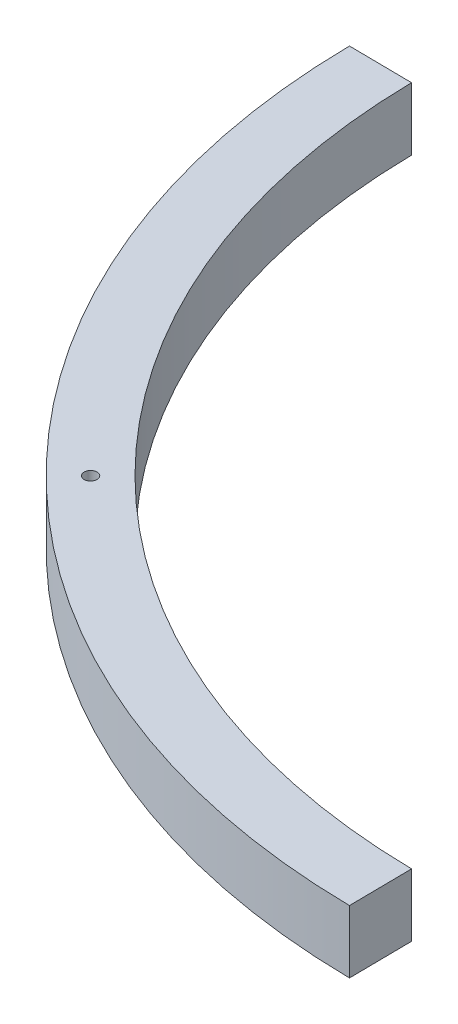
ISO-10303-21;
HEADER;
FILE_DESCRIPTION(('STEP AP214'),'2;1');
FILE_NAME('part.step','',(''),(''),'','','');
FILE_SCHEMA(('AUTOMOTIVE_DESIGN { 1 0 10303 214 1 1 1 1 }'));
ENDSEC;
DATA;
#1=APPLICATION_CONTEXT('core data for automotive mechanical design processes');
#2=APPLICATION_PROTOCOL_DEFINITION('international standard','automotive_design',2000,#1);
#3=PRODUCT_CONTEXT('',#1,'mechanical');
#4=PRODUCT('Part','Part','',(#3));
#5=PRODUCT_RELATED_PRODUCT_CATEGORY('part','',(#4));
#6=PRODUCT_DEFINITION_FORMATION('','',#4);
#7=PRODUCT_DEFINITION_CONTEXT('part definition',#1,'design');
#8=PRODUCT_DEFINITION('design','',#6,#7);
#9=PRODUCT_DEFINITION_SHAPE('','',#8);
#10=(LENGTH_UNIT() NAMED_UNIT(*) SI_UNIT(.MILLI.,.METRE.));
#11=(NAMED_UNIT(*) PLANE_ANGLE_UNIT() SI_UNIT($,.RADIAN.));
#12=(NAMED_UNIT(*) SI_UNIT($,.STERADIAN.) SOLID_ANGLE_UNIT());
#13=UNCERTAINTY_MEASURE_WITH_UNIT(LENGTH_MEASURE(1.E-05),#10,'distance_accuracy_value','');
#14=(GEOMETRIC_REPRESENTATION_CONTEXT(3) GLOBAL_UNCERTAINTY_ASSIGNED_CONTEXT((#13)) GLOBAL_UNIT_ASSIGNED_CONTEXT((#10,
#11,#12)) REPRESENTATION_CONTEXT('',''));
#15=CARTESIAN_POINT('',(0.,0.,0.));
#16=DIRECTION('',(0.,0.,1.));
#17=DIRECTION('',(1.,0.,0.));
#18=AXIS2_PLACEMENT_3D('',#15,#16,#17);
#19=CARTESIAN_POINT('',(90.,15.,-90.));
#20=DIRECTION('',(0.,1.,0.));
#21=DIRECTION('',(0.,0.,1.));
#22=AXIS2_PLACEMENT_3D('',#19,#20,#21);
#23=PLANE('',#22);
#24=CARTESIAN_POINT('',(90.,15.,-90.));
#25=DIRECTION('',(0.,1.,0.));
#26=DIRECTION('',(0.,0.,1.));
#27=AXIS2_PLACEMENT_3D('',#24,#25,#26);
#28=CIRCLE('',#27,180.011984766246);
#29=CARTESIAN_POINT('',(-90.,15.,-87.9228241569348));
#30=VERTEX_POINT('',#29);
#31=CARTESIAN_POINT('',(87.9228241569358,15.,90.));
#32=VERTEX_POINT('',#31);
#33=EDGE_CURVE('E92',#30,#32,#28,.T.);
#34=ORIENTED_EDGE('',*,*,#33,.T.);
#35=DIRECTION('',(-0.011620433145782,0.,-0.99993248048731));
#36=VECTOR('',#35,1.);
#37=CARTESIAN_POINT('',(87.9228241569358,15.,90.));
#38=LINE('',#37,#36);
#39=CARTESIAN_POINT('',(87.748327336338,15.,74.9846355580292));
#40=VERTEX_POINT('',#39);
#41=EDGE_CURVE('E87',#32,#40,#38,.T.);
#42=ORIENTED_EDGE('',*,*,#41,.T.);
#43=CARTESIAN_POINT('',(90.,15.,-90.));
#44=DIRECTION('',(0.,-1.,0.));
#45=DIRECTION('',(0.,0.,1.));
#46=AXIS2_PLACEMENT_3D('',#43,#44,#45);
#47=CIRCLE('',#46,165.);
#48=CARTESIAN_POINT('',(-74.9846583776807,15.,-87.75));
#49=VERTEX_POINT('',#48);
#50=EDGE_CURVE('E90',#40,#49,#47,.T.);
#51=ORIENTED_EDGE('',*,*,#50,.T.);
#52=DIRECTION('',(-0.999933768389495,0.,-0.011509076174179));
#53=VECTOR('',#52,1.);
#54=CARTESIAN_POINT('',(-90.,15.,-87.9228241569348));
#55=LINE('',#54,#53);
#56=EDGE_CURVE('E57',#49,#30,#55,.T.);
#57=ORIENTED_EDGE('',*,*,#56,.T.);
#58=EDGE_LOOP('',(#34,#42,#51,#57));
#59=FACE_BOUND('',#58,.T.);
#60=CARTESIAN_POINT('',(-31.9759197546794,15.,31.9759197546794));
#61=DIRECTION('',(0.,1.,0.));
#62=DIRECTION('',(0.,0.,1.));
#63=AXIS2_PLACEMENT_3D('',#60,#61,#62);
#64=CIRCLE('',#63,1.55);
#65=CARTESIAN_POINT('',(-31.9759197546794,15.,33.5259197546794));
#66=VERTEX_POINT('',#65);
#67=EDGE_CURVE('E112',#66,#66,#64,.T.);
#68=ORIENTED_EDGE('',*,*,#67,.F.);
#69=EDGE_LOOP('',(#68));
#70=FACE_BOUND('',#69,.T.);
#71=ADVANCED_FACE('F39',(#59,#70),#23,.T.);
#72=CARTESIAN_POINT('',(90.,0.,-90.));
#73=DIRECTION('',(0.,1.,0.));
#74=DIRECTION('',(0.,0.,1.));
#75=AXIS2_PLACEMENT_3D('',#72,#73,#74);
#76=PLANE('',#75);
#77=CARTESIAN_POINT('',(90.,0.,-90.));
#78=DIRECTION('',(0.,1.,0.));
#79=DIRECTION('',(0.,0.,1.));
#80=AXIS2_PLACEMENT_3D('',#77,#78,#79);
#81=CIRCLE('',#80,180.011984766246);
#82=CARTESIAN_POINT('',(-90.,0.,-87.9228241569348));
#83=VERTEX_POINT('',#82);
#84=CARTESIAN_POINT('',(87.9228241569358,0.,90.));
#85=VERTEX_POINT('',#84);
#86=EDGE_CURVE('E108',#83,#85,#81,.T.);
#87=ORIENTED_EDGE('',*,*,#86,.F.);
#88=DIRECTION('',(-0.999933768389495,0.,-0.011509076174179));
#89=VECTOR('',#88,1.);
#90=CARTESIAN_POINT('',(-90.,0.,-87.9228241569348));
#91=LINE('',#90,#89);
#92=CARTESIAN_POINT('',(-74.9846583776807,0.,-87.75));
#93=VERTEX_POINT('',#92);
#94=EDGE_CURVE('E80',#93,#83,#91,.T.);
#95=ORIENTED_EDGE('',*,*,#94,.F.);
#96=CARTESIAN_POINT('',(90.,0.,-90.));
#97=DIRECTION('',(0.,-1.,0.));
#98=DIRECTION('',(0.,0.,1.));
#99=AXIS2_PLACEMENT_3D('',#96,#97,#98);
#100=CIRCLE('',#99,165.);
#101=CARTESIAN_POINT('',(87.748327336338,0.,74.9846355580292));
#102=VERTEX_POINT('',#101);
#103=EDGE_CURVE('E74',#102,#93,#100,.T.);
#104=ORIENTED_EDGE('',*,*,#103,.F.);
#105=DIRECTION('',(-0.011620433145782,0.,-0.99993248048731));
#106=VECTOR('',#105,1.);
#107=CARTESIAN_POINT('',(87.9228241569358,0.,90.));
#108=LINE('',#107,#106);
#109=EDGE_CURVE('E97',#85,#102,#108,.T.);
#110=ORIENTED_EDGE('',*,*,#109,.F.);
#111=EDGE_LOOP('',(#87,#95,#104,#110));
#112=FACE_BOUND('',#111,.T.);
#113=CARTESIAN_POINT('',(-31.9759197546794,0.,31.9759197546794));
#114=DIRECTION('',(0.,1.,0.));
#115=DIRECTION('',(0.,0.,1.));
#116=AXIS2_PLACEMENT_3D('',#113,#114,#115);
#117=CIRCLE('',#116,1.55);
#118=CARTESIAN_POINT('',(-31.9759197546794,0.,33.5259197546794));
#119=VERTEX_POINT('',#118);
#120=EDGE_CURVE('E130',#119,#119,#117,.T.);
#121=ORIENTED_EDGE('',*,*,#120,.T.);
#122=EDGE_LOOP('',(#121));
#123=FACE_BOUND('',#122,.T.);
#124=ADVANCED_FACE('F125',(#112,#123),#76,.F.);
#125=CARTESIAN_POINT('',(90.,15.,-90.));
#126=DIRECTION('',(0.,-1.,0.));
#127=DIRECTION('',(0.,0.,-1.));
#128=AXIS2_PLACEMENT_3D('',#125,#126,#127);
#129=CYLINDRICAL_SURFACE('',#128,180.011984766246);
#130=ORIENTED_EDGE('',*,*,#86,.T.);
#131=DIRECTION('',(0.,-1.,0.));
#132=VECTOR('',#131,1.);
#133=CARTESIAN_POINT('',(87.9228241569358,15.,90.));
#134=LINE('',#133,#132);
#135=EDGE_CURVE('E11',#32,#85,#134,.T.);
#136=ORIENTED_EDGE('',*,*,#135,.F.);
#137=ORIENTED_EDGE('',*,*,#33,.F.);
#138=DIRECTION('',(0.,-1.,0.));
#139=VECTOR('',#138,1.);
#140=CARTESIAN_POINT('',(-90.,15.,-87.9228241569348));
#141=LINE('',#140,#139);
#142=EDGE_CURVE('E104',#30,#83,#141,.T.);
#143=ORIENTED_EDGE('',*,*,#142,.T.);
#144=EDGE_LOOP('',(#130,#136,#137,#143));
#145=FACE_BOUND('',#144,.T.);
#146=ADVANCED_FACE('F41',(#145),#129,.T.);
#147=CARTESIAN_POINT('',(87.9228241569358,15.,90.));
#148=DIRECTION('',(-0.99993248048731,0.,0.011620433145782));
#149=DIRECTION('',(0.011620433145782,0.,0.99993248048731));
#150=AXIS2_PLACEMENT_3D('',#147,#148,#149);
#151=PLANE('',#150);
#152=ORIENTED_EDGE('',*,*,#109,.T.);
#153=DIRECTION('',(0.,-1.,0.));
#154=VECTOR('',#153,1.);
#155=CARTESIAN_POINT('',(87.748327336338,15.,74.9846355580292));
#156=LINE('',#155,#154);
#157=EDGE_CURVE('E49',#40,#102,#156,.T.);
#158=ORIENTED_EDGE('',*,*,#157,.F.);
#159=ORIENTED_EDGE('',*,*,#41,.F.);
#160=ORIENTED_EDGE('',*,*,#135,.T.);
#161=EDGE_LOOP('',(#152,#158,#159,#160));
#162=FACE_BOUND('',#161,.T.);
#163=ADVANCED_FACE('F96',(#162),#151,.F.);
#164=CARTESIAN_POINT('',(90.,15.,-90.));
#165=DIRECTION('',(0.,-1.,0.));
#166=DIRECTION('',(0.,0.,-1.));
#167=AXIS2_PLACEMENT_3D('',#164,#165,#166);
#168=CYLINDRICAL_SURFACE('',#167,165.);
#169=ORIENTED_EDGE('',*,*,#103,.T.);
#170=DIRECTION('',(0.,-1.,0.));
#171=VECTOR('',#170,1.);
#172=CARTESIAN_POINT('',(-74.9846583776807,15.,-87.75));
#173=LINE('',#172,#171);
#174=EDGE_CURVE('E99',#49,#93,#173,.T.);
#175=ORIENTED_EDGE('',*,*,#174,.F.);
#176=ORIENTED_EDGE('',*,*,#50,.F.);
#177=ORIENTED_EDGE('',*,*,#157,.T.);
#178=EDGE_LOOP('',(#169,#175,#176,#177));
#179=FACE_BOUND('',#178,.T.);
#180=ADVANCED_FACE('F100',(#179),#168,.F.);
#181=CARTESIAN_POINT('',(-90.,15.,-87.9228241569348));
#182=DIRECTION('',(-0.011509076174179,0.,0.999933768389495));
#183=DIRECTION('',(0.999933768389495,0.,0.011509076174179));
#184=AXIS2_PLACEMENT_3D('',#181,#182,#183);
#185=PLANE('',#184);
#186=ORIENTED_EDGE('',*,*,#94,.T.);
#187=ORIENTED_EDGE('',*,*,#142,.F.);
#188=ORIENTED_EDGE('',*,*,#56,.F.);
#189=ORIENTED_EDGE('',*,*,#174,.T.);
#190=EDGE_LOOP('',(#186,#187,#188,#189));
#191=FACE_BOUND('',#190,.T.);
#192=ADVANCED_FACE('F122',(#191),#185,.F.);
#193=CARTESIAN_POINT('',(-31.9759197546794,15.,31.9759197546794));
#194=DIRECTION('',(0.,-1.,0.));
#195=DIRECTION('',(0.,0.,-1.));
#196=AXIS2_PLACEMENT_3D('',#193,#194,#195);
#197=CYLINDRICAL_SURFACE('',#196,1.55);
#198=ORIENTED_EDGE('',*,*,#67,.T.);
#199=EDGE_LOOP('',(#198));
#200=FACE_BOUND('',#199,.T.);
#201=ORIENTED_EDGE('',*,*,#120,.F.);
#202=EDGE_LOOP('',(#201));
#203=FACE_BOUND('',#202,.T.);
#204=ADVANCED_FACE('F138',(#200,#203),#197,.F.);
#205=CLOSED_SHELL('',(#71,#124,#146,#163,#180,#192,#204));
#206=MANIFOLD_SOLID_BREP('B2',#205);
#207=ADVANCED_BREP_SHAPE_REPRESENTATION('',(#18,#206),#14);
#208=SHAPE_DEFINITION_REPRESENTATION(#9,#207);
ENDSEC;
END-ISO-10303-21;
